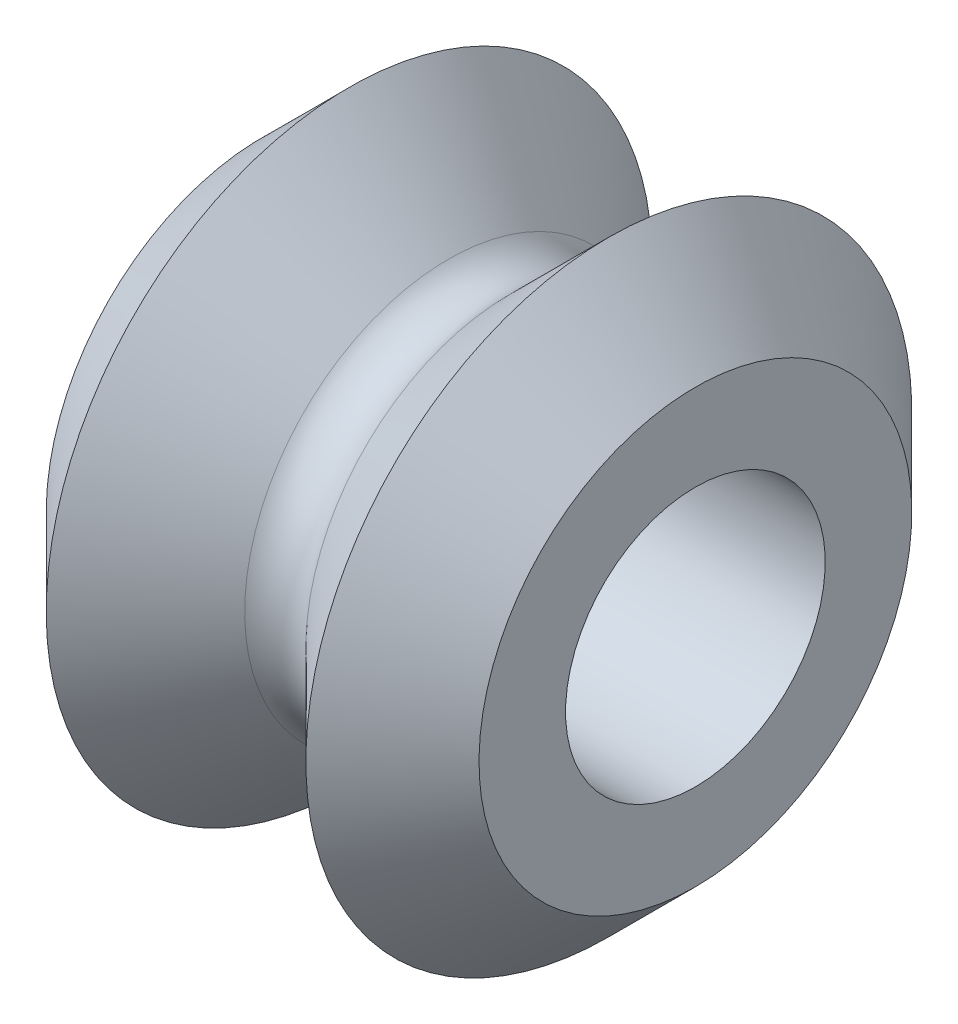
ISO-10303-21;
HEADER;
FILE_DESCRIPTION(('STEP AP214'),'2;1');
FILE_NAME('part.step','',(''),(''),'','','');
FILE_SCHEMA(('AUTOMOTIVE_DESIGN { 1 0 10303 214 1 1 1 1 }'));
ENDSEC;
DATA;
#1=APPLICATION_CONTEXT('core data for automotive mechanical design processes');
#2=APPLICATION_PROTOCOL_DEFINITION('international standard','automotive_design',2000,#1);
#3=PRODUCT_CONTEXT('',#1,'mechanical');
#4=PRODUCT('Part','Part','',(#3));
#5=PRODUCT_RELATED_PRODUCT_CATEGORY('part','',(#4));
#6=PRODUCT_DEFINITION_FORMATION('','',#4);
#7=PRODUCT_DEFINITION_CONTEXT('part definition',#1,'design');
#8=PRODUCT_DEFINITION('design','',#6,#7);
#9=PRODUCT_DEFINITION_SHAPE('','',#8);
#10=(LENGTH_UNIT() NAMED_UNIT(*) SI_UNIT(.MILLI.,.METRE.));
#11=(NAMED_UNIT(*) PLANE_ANGLE_UNIT() SI_UNIT($,.RADIAN.));
#12=(NAMED_UNIT(*) SI_UNIT($,.STERADIAN.) SOLID_ANGLE_UNIT());
#13=UNCERTAINTY_MEASURE_WITH_UNIT(LENGTH_MEASURE(1.E-05),#10,'distance_accuracy_value','');
#14=(GEOMETRIC_REPRESENTATION_CONTEXT(3) GLOBAL_UNCERTAINTY_ASSIGNED_CONTEXT((#13)) GLOBAL_UNIT_ASSIGNED_CONTEXT((#10,
#11,#12)) REPRESENTATION_CONTEXT('',''));
#15=CARTESIAN_POINT('',(0.,0.,0.));
#16=DIRECTION('',(0.,0.,1.));
#17=DIRECTION('',(1.,0.,0.));
#18=AXIS2_PLACEMENT_3D('',#15,#16,#17);
#19=CARTESIAN_POINT('',(5.,0.,0.));
#20=DIRECTION('',(-1.,0.,0.));
#21=DIRECTION('',(0.,-1.,0.));
#22=AXIS2_PLACEMENT_3D('',#19,#20,#21);
#23=PLANE('',#22);
#24=CARTESIAN_POINT('',(5.,0.,0.));
#25=DIRECTION('',(1.,0.,0.));
#26=DIRECTION('',(0.,1.,0.));
#27=AXIS2_PLACEMENT_3D('',#24,#25,#26);
#28=CIRCLE('',#27,3.);
#29=CARTESIAN_POINT('',(5.,3.,0.));
#30=VERTEX_POINT('',#29);
#31=EDGE_CURVE('E76',#30,#30,#28,.T.);
#32=ORIENTED_EDGE('',*,*,#31,.F.);
#33=EDGE_LOOP('',(#32));
#34=FACE_BOUND('',#33,.T.);
#35=CARTESIAN_POINT('',(5.,0.,0.));
#36=DIRECTION('',(-1.,0.,0.));
#37=DIRECTION('',(0.,-1.,0.));
#38=AXIS2_PLACEMENT_3D('',#35,#36,#37);
#39=CIRCLE('',#38,5.);
#40=CARTESIAN_POINT('',(5.00000000000001,-5.,0.));
#41=VERTEX_POINT('',#40);
#42=EDGE_CURVE('E56',#41,#41,#39,.T.);
#43=ORIENTED_EDGE('',*,*,#42,.F.);
#44=EDGE_LOOP('',(#43));
#45=FACE_BOUND('',#44,.T.);
#46=ADVANCED_FACE('F43',(#34,#45),#23,.F.);
#47=CARTESIAN_POINT('',(5.,0.,0.));
#48=DIRECTION('',(-1.,0.,0.));
#49=DIRECTION('',(0.,-1.,0.));
#50=AXIS2_PLACEMENT_3D('',#47,#48,#49);
#51=CONICAL_SURFACE('',#50,5.,0.785398163397447);
#52=CARTESIAN_POINT('',(3.00000000000001,0.,0.));
#53=DIRECTION('',(-1.,0.,0.));
#54=DIRECTION('',(0.,-1.,0.));
#55=AXIS2_PLACEMENT_3D('',#52,#53,#54);
#56=CIRCLE('',#55,6.99999999999999);
#57=CARTESIAN_POINT('',(3.00000000000001,-6.99999999999999,0.));
#58=VERTEX_POINT('',#57);
#59=EDGE_CURVE('E61',#58,#58,#56,.T.);
#60=ORIENTED_EDGE('',*,*,#59,.F.);
#61=EDGE_LOOP('',(#60));
#62=FACE_BOUND('',#61,.T.);
#63=ORIENTED_EDGE('',*,*,#42,.T.);
#64=EDGE_LOOP('',(#63));
#65=FACE_BOUND('',#64,.T.);
#66=ADVANCED_FACE('F95',(#62,#65),#51,.T.);
#67=CARTESIAN_POINT('',(3.00000000000001,0.,0.));
#68=DIRECTION('',(1.,0.,0.));
#69=DIRECTION('',(0.,1.,0.));
#70=AXIS2_PLACEMENT_3D('',#67,#68,#69);
#71=CONICAL_SURFACE('',#70,6.99999999999999,0.785398163397448);
#72=CARTESIAN_POINT('',(0.707106781186552,0.,0.));
#73=DIRECTION('',(1.,0.,0.));
#74=DIRECTION('',(0.,1.,0.));
#75=AXIS2_PLACEMENT_3D('',#72,#73,#74);
#76=CIRCLE('',#75,4.70710678118654);
#77=CARTESIAN_POINT('',(0.707106781186551,4.70710678118654,0.));
#78=VERTEX_POINT('',#77);
#79=EDGE_CURVE('E10',#78,#78,#76,.T.);
#80=ORIENTED_EDGE('',*,*,#79,.T.);
#81=EDGE_LOOP('',(#80));
#82=FACE_BOUND('',#81,.T.);
#83=ORIENTED_EDGE('',*,*,#59,.T.);
#84=EDGE_LOOP('',(#83));
#85=FACE_BOUND('',#84,.T.);
#86=ADVANCED_FACE('F99',(#82,#85),#71,.T.);
#87=CARTESIAN_POINT('',(0.,0.,0.));
#88=DIRECTION('',(-1.,0.,0.));
#89=DIRECTION('',(0.,-1.,0.));
#90=AXIS2_PLACEMENT_3D('',#87,#88,#89);
#91=CONICAL_SURFACE('',#90,3.99999999999999,0.785398163397448);
#92=CARTESIAN_POINT('',(-0.707106781186544,0.,0.));
#93=DIRECTION('',(-1.,0.,0.));
#94=DIRECTION('',(0.,-1.,0.));
#95=AXIS2_PLACEMENT_3D('',#92,#93,#94);
#96=CIRCLE('',#95,4.70710678118654);
#97=CARTESIAN_POINT('',(-0.707106781186544,-4.70710678118654,0.));
#98=VERTEX_POINT('',#97);
#99=EDGE_CURVE('E51',#98,#98,#96,.T.);
#100=ORIENTED_EDGE('',*,*,#99,.T.);
#101=EDGE_LOOP('',(#100));
#102=FACE_BOUND('',#101,.T.);
#103=CARTESIAN_POINT('',(-3.,0.,0.));
#104=DIRECTION('',(-1.,0.,0.));
#105=DIRECTION('',(0.,-1.,0.));
#106=AXIS2_PLACEMENT_3D('',#103,#104,#105);
#107=CIRCLE('',#106,6.99999999999999);
#108=CARTESIAN_POINT('',(-3.,-6.99999999999999,0.));
#109=VERTEX_POINT('',#108);
#110=EDGE_CURVE('E67',#109,#109,#107,.T.);
#111=ORIENTED_EDGE('',*,*,#110,.F.);
#112=EDGE_LOOP('',(#111));
#113=FACE_BOUND('',#112,.T.);
#114=ADVANCED_FACE('F105',(#102,#113),#91,.T.);
#115=CARTESIAN_POINT('',(-3.,0.,0.));
#116=DIRECTION('',(1.,0.,0.));
#117=DIRECTION('',(0.,1.,0.));
#118=AXIS2_PLACEMENT_3D('',#115,#116,#117);
#119=CONICAL_SURFACE('',#118,6.99999999999999,0.785398163397447);
#120=CARTESIAN_POINT('',(-5.,0.,0.));
#121=DIRECTION('',(-1.,0.,0.));
#122=DIRECTION('',(0.,-1.,0.));
#123=AXIS2_PLACEMENT_3D('',#120,#121,#122);
#124=CIRCLE('',#123,5.);
#125=CARTESIAN_POINT('',(-5.,-5.,0.));
#126=VERTEX_POINT('',#125);
#127=EDGE_CURVE('E71',#126,#126,#124,.T.);
#128=ORIENTED_EDGE('',*,*,#127,.F.);
#129=EDGE_LOOP('',(#128));
#130=FACE_BOUND('',#129,.T.);
#131=ORIENTED_EDGE('',*,*,#110,.T.);
#132=EDGE_LOOP('',(#131));
#133=FACE_BOUND('',#132,.T.);
#134=ADVANCED_FACE('F111',(#130,#133),#119,.T.);
#135=CARTESIAN_POINT('',(-5.,5.,0.));
#136=DIRECTION('',(1.,0.,0.));
#137=DIRECTION('',(0.,1.,0.));
#138=AXIS2_PLACEMENT_3D('',#135,#136,#137);
#139=PLANE('',#138);
#140=CARTESIAN_POINT('',(-5.,0.,0.));
#141=DIRECTION('',(1.,0.,0.));
#142=DIRECTION('',(0.,1.,0.));
#143=AXIS2_PLACEMENT_3D('',#140,#141,#142);
#144=CIRCLE('',#143,3.);
#145=CARTESIAN_POINT('',(-5.,3.,0.));
#146=VERTEX_POINT('',#145);
#147=EDGE_CURVE('E75',#146,#146,#144,.T.);
#148=ORIENTED_EDGE('',*,*,#147,.T.);
#149=EDGE_LOOP('',(#148));
#150=FACE_BOUND('',#149,.T.);
#151=ORIENTED_EDGE('',*,*,#127,.T.);
#152=EDGE_LOOP('',(#151));
#153=FACE_BOUND('',#152,.T.);
#154=ADVANCED_FACE('F84',(#150,#153),#139,.F.);
#155=CARTESIAN_POINT('',(0.,0.,0.));
#156=DIRECTION('',(-1.,0.,0.));
#157=DIRECTION('',(0.,-1.,0.));
#158=AXIS2_PLACEMENT_3D('',#155,#156,#157);
#159=TOROIDAL_SURFACE('',#158,5.41421356237309,1.);
#160=ORIENTED_EDGE('',*,*,#79,.F.);
#161=EDGE_LOOP('',(#160));
#162=FACE_BOUND('',#161,.T.);
#163=ORIENTED_EDGE('',*,*,#99,.F.);
#164=EDGE_LOOP('',(#163));
#165=FACE_BOUND('',#164,.T.);
#166=ADVANCED_FACE('F45',(#162,#165),#159,.F.);
#167=CARTESIAN_POINT('',(-5.,0.,0.));
#168=DIRECTION('',(1.,0.,0.));
#169=DIRECTION('',(0.,1.,0.));
#170=AXIS2_PLACEMENT_3D('',#167,#168,#169);
#171=CYLINDRICAL_SURFACE('',#170,3.);
#172=ORIENTED_EDGE('',*,*,#147,.F.);
#173=EDGE_LOOP('',(#172));
#174=FACE_BOUND('',#173,.T.);
#175=ORIENTED_EDGE('',*,*,#31,.T.);
#176=EDGE_LOOP('',(#175));
#177=FACE_BOUND('',#176,.T.);
#178=ADVANCED_FACE('F87',(#174,#177),#171,.F.);
#179=CLOSED_SHELL('',(#46,#66,#86,#114,#134,#154,#166,#178));
#180=MANIFOLD_SOLID_BREP('B2',#179);
#181=ADVANCED_BREP_SHAPE_REPRESENTATION('',(#18,#180),#14);
#182=SHAPE_DEFINITION_REPRESENTATION(#9,#181);
ENDSEC;
END-ISO-10303-21;
